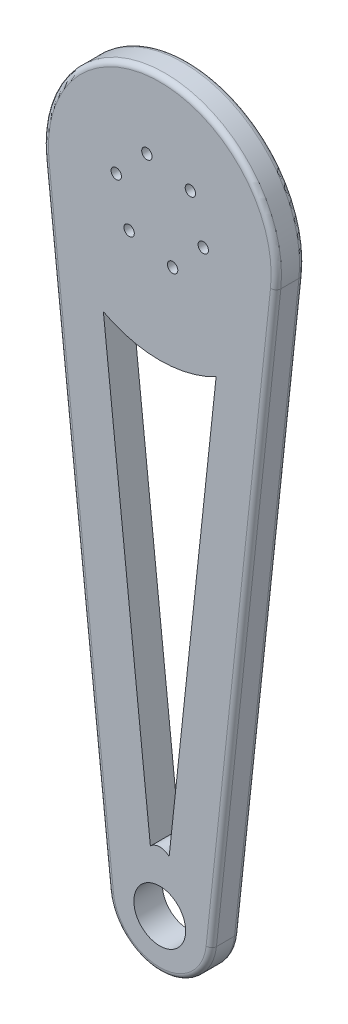
ISO-10303-21;
HEADER;
FILE_DESCRIPTION(('STEP AP214'),'2;1');
FILE_NAME('part.step','',(''),(''),'','','');
FILE_SCHEMA(('AUTOMOTIVE_DESIGN { 1 0 10303 214 1 1 1 1 }'));
ENDSEC;
DATA;
#1=APPLICATION_CONTEXT('core data for automotive mechanical design processes');
#2=APPLICATION_PROTOCOL_DEFINITION('international standard','automotive_design',2000,#1);
#3=PRODUCT_CONTEXT('',#1,'mechanical');
#4=PRODUCT('Part','Part','',(#3));
#5=PRODUCT_RELATED_PRODUCT_CATEGORY('part','',(#4));
#6=PRODUCT_DEFINITION_FORMATION('','',#4);
#7=PRODUCT_DEFINITION_CONTEXT('part definition',#1,'design');
#8=PRODUCT_DEFINITION('design','',#6,#7);
#9=PRODUCT_DEFINITION_SHAPE('','',#8);
#10=(LENGTH_UNIT() NAMED_UNIT(*) SI_UNIT(.MILLI.,.METRE.));
#11=(NAMED_UNIT(*) PLANE_ANGLE_UNIT() SI_UNIT($,.RADIAN.));
#12=(NAMED_UNIT(*) SI_UNIT($,.STERADIAN.) SOLID_ANGLE_UNIT());
#13=UNCERTAINTY_MEASURE_WITH_UNIT(LENGTH_MEASURE(1.E-05),#10,'distance_accuracy_value','');
#14=(GEOMETRIC_REPRESENTATION_CONTEXT(3) GLOBAL_UNCERTAINTY_ASSIGNED_CONTEXT((#13)) GLOBAL_UNIT_ASSIGNED_CONTEXT((#10,
#11,#12)) REPRESENTATION_CONTEXT('',''));
#15=CARTESIAN_POINT('',(0.,0.,0.));
#16=DIRECTION('',(0.,0.,1.));
#17=DIRECTION('',(1.,0.,0.));
#18=AXIS2_PLACEMENT_3D('',#15,#16,#17);
#19=CARTESIAN_POINT('',(0.,0.,11.));
#20=DIRECTION('',(0.,0.,-1.));
#21=DIRECTION('',(-1.,0.,0.));
#22=AXIS2_PLACEMENT_3D('',#19,#20,#21);
#23=CYLINDRICAL_SURFACE('',#22,45.);
#24=DIRECTION('',(0.,0.,-1.));
#25=VECTOR('',#24,1.);
#26=CARTESIAN_POINT('',(-44.744635323375,-4.7872340425532,11.));
#27=LINE('',#26,#25);
#28=CARTESIAN_POINT('',(-44.744635323375,-4.7872340425532,9.));
#29=VERTEX_POINT('',#28);
#30=CARTESIAN_POINT('',(-44.744635323375,-4.7872340425532,2.));
#31=VERTEX_POINT('',#30);
#32=EDGE_CURVE('E186',#29,#31,#27,.T.);
#33=ORIENTED_EDGE('',*,*,#32,.F.);
#34=CARTESIAN_POINT('',(0.,0.,9.));
#35=DIRECTION('',(0.,0.,-1.));
#36=DIRECTION('',(-1.,0.,0.));
#37=AXIS2_PLACEMENT_3D('',#34,#35,#36);
#38=CIRCLE('',#37,45.);
#39=CARTESIAN_POINT('',(44.744635323375,-4.78723404255319,9.));
#40=VERTEX_POINT('',#39);
#41=EDGE_CURVE('E200',#29,#40,#38,.T.);
#42=ORIENTED_EDGE('',*,*,#41,.T.);
#43=DIRECTION('',(0.,0.,-1.));
#44=VECTOR('',#43,1.);
#45=CARTESIAN_POINT('',(44.744635323375,-4.78723404255319,11.));
#46=LINE('',#45,#44);
#47=CARTESIAN_POINT('',(44.744635323375,-4.78723404255319,2.));
#48=VERTEX_POINT('',#47);
#49=EDGE_CURVE('E173',#40,#48,#46,.T.);
#50=ORIENTED_EDGE('',*,*,#49,.T.);
#51=CARTESIAN_POINT('',(0.,0.,2.));
#52=DIRECTION('',(0.,0.,-1.));
#53=DIRECTION('',(-1.,0.,0.));
#54=AXIS2_PLACEMENT_3D('',#51,#52,#53);
#55=CIRCLE('',#54,45.);
#56=EDGE_CURVE('E198',#48,#31,#55,.F.);
#57=ORIENTED_EDGE('',*,*,#56,.T.);
#58=EDGE_LOOP('',(#33,#42,#50,#57));
#59=FACE_BOUND('',#58,.T.);
#60=ADVANCED_FACE('F41',(#59),#23,.T.);
#61=CARTESIAN_POINT('',(-44.744635323375,-4.7872340425532,11.));
#62=DIRECTION('',(0.994325229408334,0.106382978723404,0.));
#63=DIRECTION('',(-0.106382978723404,0.994325229408334,0.));
#64=AXIS2_PLACEMENT_3D('',#61,#62,#63);
#65=PLANE('',#64);
#66=DIRECTION('',(0.,0.,-1.));
#67=VECTOR('',#66,1.);
#68=CARTESIAN_POINT('',(-19.8865045881667,-237.127659574468,11.));
#69=LINE('',#68,#67);
#70=CARTESIAN_POINT('',(-19.8865045881667,-237.127659574468,9.));
#71=VERTEX_POINT('',#70);
#72=CARTESIAN_POINT('',(-19.8865045881667,-237.127659574468,2.));
#73=VERTEX_POINT('',#72);
#74=EDGE_CURVE('E183',#71,#73,#69,.T.);
#75=ORIENTED_EDGE('',*,*,#74,.F.);
#76=DIRECTION('',(0.106382978723404,-0.994325229408334,0.));
#77=VECTOR('',#76,1.);
#78=CARTESIAN_POINT('',(-44.744635323375,-4.7872340425532,9.));
#79=LINE('',#78,#77);
#80=EDGE_CURVE('E214',#71,#29,#79,.F.);
#81=ORIENTED_EDGE('',*,*,#80,.T.);
#82=ORIENTED_EDGE('',*,*,#32,.T.);
#83=DIRECTION('',(0.106382978723404,-0.994325229408334,0.));
#84=VECTOR('',#83,1.);
#85=CARTESIAN_POINT('',(-19.8865045881667,-237.127659574468,2.));
#86=LINE('',#85,#84);
#87=EDGE_CURVE('E212',#31,#73,#86,.T.);
#88=ORIENTED_EDGE('',*,*,#87,.T.);
#89=EDGE_LOOP('',(#75,#81,#82,#88));
#90=FACE_BOUND('',#89,.T.);
#91=ADVANCED_FACE('F316',(#90),#65,.F.);
#92=CARTESIAN_POINT('',(0.,-235.,11.));
#93=DIRECTION('',(0.,0.,-1.));
#94=DIRECTION('',(-1.,0.,0.));
#95=AXIS2_PLACEMENT_3D('',#92,#93,#94);
#96=CYLINDRICAL_SURFACE('',#95,20.);
#97=DIRECTION('',(0.,0.,-1.));
#98=VECTOR('',#97,1.);
#99=CARTESIAN_POINT('',(19.8865045881667,-237.127659574468,11.));
#100=LINE('',#99,#98);
#101=CARTESIAN_POINT('',(19.8865045881667,-237.127659574468,9.));
#102=VERTEX_POINT('',#101);
#103=CARTESIAN_POINT('',(19.8865045881667,-237.127659574468,2.));
#104=VERTEX_POINT('',#103);
#105=EDGE_CURVE('E180',#102,#104,#100,.T.);
#106=ORIENTED_EDGE('',*,*,#105,.F.);
#107=CARTESIAN_POINT('',(0.,-235.,9.));
#108=DIRECTION('',(0.,0.,-1.));
#109=DIRECTION('',(-1.,0.,0.));
#110=AXIS2_PLACEMENT_3D('',#107,#108,#109);
#111=CIRCLE('',#110,20.);
#112=EDGE_CURVE('E206',#102,#71,#111,.T.);
#113=ORIENTED_EDGE('',*,*,#112,.T.);
#114=ORIENTED_EDGE('',*,*,#74,.T.);
#115=CARTESIAN_POINT('',(0.,-235.,2.));
#116=DIRECTION('',(0.,0.,-1.));
#117=DIRECTION('',(-1.,0.,0.));
#118=AXIS2_PLACEMENT_3D('',#115,#116,#117);
#119=CIRCLE('',#118,20.);
#120=EDGE_CURVE('E203',#73,#104,#119,.F.);
#121=ORIENTED_EDGE('',*,*,#120,.T.);
#122=EDGE_LOOP('',(#106,#113,#114,#121));
#123=FACE_BOUND('',#122,.T.);
#124=ADVANCED_FACE('F322',(#123),#96,.T.);
#125=CARTESIAN_POINT('',(44.744635323375,-4.78723404255319,11.));
#126=DIRECTION('',(-0.994325229408334,0.106382978723404,0.));
#127=DIRECTION('',(-0.106382978723404,-0.994325229408334,0.));
#128=AXIS2_PLACEMENT_3D('',#125,#126,#127);
#129=PLANE('',#128);
#130=ORIENTED_EDGE('',*,*,#49,.F.);
#131=DIRECTION('',(0.106382978723404,0.994325229408334,0.));
#132=VECTOR('',#131,1.);
#133=CARTESIAN_POINT('',(44.744635323375,-4.78723404255319,9.));
#134=LINE('',#133,#132);
#135=EDGE_CURVE('E210',#40,#102,#134,.F.);
#136=ORIENTED_EDGE('',*,*,#135,.T.);
#137=ORIENTED_EDGE('',*,*,#105,.T.);
#138=DIRECTION('',(0.106382978723404,0.994325229408334,0.));
#139=VECTOR('',#138,1.);
#140=CARTESIAN_POINT('',(44.744635323375,-4.78723404255319,2.));
#141=LINE('',#140,#139);
#142=EDGE_CURVE('E208',#104,#48,#141,.T.);
#143=ORIENTED_EDGE('',*,*,#142,.T.);
#144=EDGE_LOOP('',(#130,#136,#137,#143));
#145=FACE_BOUND('',#144,.T.);
#146=ADVANCED_FACE('F282',(#145),#129,.F.);
#147=CARTESIAN_POINT('',(0.,0.,11.));
#148=DIRECTION('',(0.,0.,-1.));
#149=DIRECTION('',(-1.,0.,0.));
#150=AXIS2_PLACEMENT_3D('',#147,#148,#149);
#151=PLANE('',#150);
#152=CARTESIAN_POINT('',(-16.7892443822872,3.96027436825242,11.));
#153=DIRECTION('',(0.,0.,1.));
#154=DIRECTION('',(1.,0.,0.));
#155=AXIS2_PLACEMENT_3D('',#152,#153,#154);
#156=CIRCLE('',#155,2.);
#157=CARTESIAN_POINT('',(-14.7892443822872,3.96027436825242,11.));
#158=VERTEX_POINT('',#157);
#159=EDGE_CURVE('E243',#158,#158,#156,.T.);
#160=ORIENTED_EDGE('',*,*,#159,.F.);
#161=EDGE_LOOP('',(#160));
#162=FACE_BOUND('',#161,.T.);
#163=CARTESIAN_POINT('',(-4.96492398228065,16.5200493295321,11.));
#164=DIRECTION('',(0.,0.,1.));
#165=DIRECTION('',(1.,0.,0.));
#166=AXIS2_PLACEMENT_3D('',#163,#164,#165);
#167=CIRCLE('',#166,2.);
#168=CARTESIAN_POINT('',(-2.96492398228065,16.5200493295321,11.));
#169=VERTEX_POINT('',#168);
#170=EDGE_CURVE('E271',#169,#169,#167,.T.);
#171=ORIENTED_EDGE('',*,*,#170,.F.);
#172=EDGE_LOOP('',(#171));
#173=FACE_BOUND('',#172,.T.);
#174=CARTESIAN_POINT('',(11.8243204000066,12.5597749612797,11.));
#175=DIRECTION('',(0.,0.,1.));
#176=DIRECTION('',(1.,0.,0.));
#177=AXIS2_PLACEMENT_3D('',#174,#175,#176);
#178=CIRCLE('',#177,2.);
#179=CARTESIAN_POINT('',(13.8243204000066,12.5597749612797,11.));
#180=VERTEX_POINT('',#179);
#181=EDGE_CURVE('E268',#180,#180,#178,.T.);
#182=ORIENTED_EDGE('',*,*,#181,.F.);
#183=EDGE_LOOP('',(#182));
#184=FACE_BOUND('',#183,.T.);
#185=CARTESIAN_POINT('',(16.7892443822872,-3.96027436825241,11.));
#186=DIRECTION('',(0.,0.,1.));
#187=DIRECTION('',(1.,0.,0.));
#188=AXIS2_PLACEMENT_3D('',#185,#186,#187);
#189=CIRCLE('',#188,2.);
#190=CARTESIAN_POINT('',(18.7892443822872,-3.96027436825241,11.));
#191=VERTEX_POINT('',#190);
#192=EDGE_CURVE('E265',#191,#191,#189,.T.);
#193=ORIENTED_EDGE('',*,*,#192,.F.);
#194=EDGE_LOOP('',(#193));
#195=FACE_BOUND('',#194,.T.);
#196=CARTESIAN_POINT('',(4.96492398228066,-16.5200493295321,11.));
#197=DIRECTION('',(0.,0.,1.));
#198=DIRECTION('',(1.,0.,0.));
#199=AXIS2_PLACEMENT_3D('',#196,#197,#198);
#200=CIRCLE('',#199,2.);
#201=CARTESIAN_POINT('',(6.96492398228066,-16.5200493295321,11.));
#202=VERTEX_POINT('',#201);
#203=EDGE_CURVE('E262',#202,#202,#200,.T.);
#204=ORIENTED_EDGE('',*,*,#203,.F.);
#205=EDGE_LOOP('',(#204));
#206=FACE_BOUND('',#205,.T.);
#207=CARTESIAN_POINT('',(-11.8243204000066,-12.5597749612797,11.));
#208=DIRECTION('',(0.,0.,1.));
#209=DIRECTION('',(1.,0.,0.));
#210=AXIS2_PLACEMENT_3D('',#207,#208,#209);
#211=CIRCLE('',#210,2.);
#212=CARTESIAN_POINT('',(-9.82432040000657,-12.5597749612797,11.));
#213=VERTEX_POINT('',#212);
#214=EDGE_CURVE('E259',#213,#213,#211,.T.);
#215=ORIENTED_EDGE('',*,*,#214,.F.);
#216=EDGE_LOOP('',(#215));
#217=FACE_BOUND('',#216,.T.);
#218=DIRECTION('',(-0.106382978723404,0.994325229408334,0.));
#219=VECTOR('',#218,1.);
#220=CARTESIAN_POINT('',(-26.2400238080358,-2.80742337809627,11.));
#221=LINE('',#220,#219);
#222=CARTESIAN_POINT('',(-3.61533826232206,-214.272602446108,11.));
#223=VERTEX_POINT('',#222);
#224=CARTESIAN_POINT('',(-21.7598242236514,-44.6823128857545,11.));
#225=VERTEX_POINT('',#224);
#226=EDGE_CURVE('E163',#223,#225,#221,.T.);
#227=ORIENTED_EDGE('',*,*,#226,.T.);
#228=CARTESIAN_POINT('',(0.,-3.35092271043229,11.));
#229=DIRECTION('',(0.,0.,-1.));
#230=DIRECTION('',(-1.,0.,0.));
#231=AXIS2_PLACEMENT_3D('',#228,#229,#230);
#232=CIRCLE('',#231,46.7094611836717);
#233=CARTESIAN_POINT('',(21.7598242236514,-44.6823128857545,11.));
#234=VERTEX_POINT('',#233);
#235=EDGE_CURVE('E166',#225,#234,#232,.F.);
#236=ORIENTED_EDGE('',*,*,#235,.T.);
#237=DIRECTION('',(-0.106382978723404,-0.994325229408334,0.));
#238=VECTOR('',#237,1.);
#239=CARTESIAN_POINT('',(26.2400238080358,-2.80742337809627,11.));
#240=LINE('',#239,#238);
#241=CARTESIAN_POINT('',(3.6259912783284,-214.173032357815,11.));
#242=VERTEX_POINT('',#241);
#243=EDGE_CURVE('E158',#234,#242,#240,.T.);
#244=ORIENTED_EDGE('',*,*,#243,.T.);
#245=CARTESIAN_POINT('',(0.0551115521497599,-217.843482172287,11.));
#246=DIRECTION('',(0.,0.,-1.));
#247=DIRECTION('',(-1.,0.,0.));
#248=AXIS2_PLACEMENT_3D('',#245,#246,#247);
#249=CIRCLE('',#248,5.12087725486467);
#250=EDGE_CURVE('E138',#242,#223,#249,.F.);
#251=ORIENTED_EDGE('',*,*,#250,.T.);
#252=EDGE_LOOP('',(#227,#236,#244,#251));
#253=FACE_BOUND('',#252,.T.);
#254=CARTESIAN_POINT('',(0.,-235.,11.));
#255=DIRECTION('',(0.,0.,-1.));
#256=DIRECTION('',(-1.,0.,0.));
#257=AXIS2_PLACEMENT_3D('',#254,#255,#256);
#258=CIRCLE('',#257,18.);
#259=CARTESIAN_POINT('',(-17.89785412935,-236.914893617021,11.));
#260=VERTEX_POINT('',#259);
#261=CARTESIAN_POINT('',(17.89785412935,-236.914893617021,11.));
#262=VERTEX_POINT('',#261);
#263=EDGE_CURVE('E191',#260,#262,#258,.F.);
#264=ORIENTED_EDGE('',*,*,#263,.T.);
#265=DIRECTION('',(0.106382978723404,0.994325229408334,0.));
#266=VECTOR('',#265,1.);
#267=CARTESIAN_POINT('',(42.7559848645584,-4.57446808510638,11.));
#268=LINE('',#267,#266);
#269=CARTESIAN_POINT('',(42.7559848645584,-4.57446808510638,11.));
#270=VERTEX_POINT('',#269);
#271=EDGE_CURVE('E196',#262,#270,#268,.T.);
#272=ORIENTED_EDGE('',*,*,#271,.T.);
#273=CARTESIAN_POINT('',(0.,0.,11.));
#274=DIRECTION('',(0.,0.,-1.));
#275=DIRECTION('',(-1.,0.,0.));
#276=AXIS2_PLACEMENT_3D('',#273,#274,#275);
#277=CIRCLE('',#276,43.);
#278=CARTESIAN_POINT('',(-42.7559848645584,-4.57446808510639,11.));
#279=VERTEX_POINT('',#278);
#280=EDGE_CURVE('E193',#270,#279,#277,.F.);
#281=ORIENTED_EDGE('',*,*,#280,.T.);
#282=DIRECTION('',(0.106382978723404,-0.994325229408334,0.));
#283=VECTOR('',#282,1.);
#284=CARTESIAN_POINT('',(-42.7559848645584,-4.57446808510639,11.));
#285=LINE('',#284,#283);
#286=EDGE_CURVE('E189',#279,#260,#285,.T.);
#287=ORIENTED_EDGE('',*,*,#286,.T.);
#288=EDGE_LOOP('',(#264,#272,#281,#287));
#289=FACE_BOUND('',#288,.T.);
#290=CARTESIAN_POINT('',(0.,-235.836034694728,11.));
#291=DIRECTION('',(0.,0.,-1.));
#292=DIRECTION('',(-1.,0.,0.));
#293=AXIS2_PLACEMENT_3D('',#290,#291,#292);
#294=CIRCLE('',#293,10.);
#295=CARTESIAN_POINT('',(-10.,-235.836034694728,11.));
#296=VERTEX_POINT('',#295);
#297=EDGE_CURVE('E170',#296,#296,#294,.T.);
#298=ORIENTED_EDGE('',*,*,#297,.T.);
#299=EDGE_LOOP('',(#298));
#300=FACE_BOUND('',#299,.T.);
#301=ADVANCED_FACE('F279',(#162,#173,#184,#195,#206,#217,#253,#289,#300),#151,.F.);
#302=CARTESIAN_POINT('',(0.,0.,0.));
#303=DIRECTION('',(0.,0.,-1.));
#304=DIRECTION('',(-1.,0.,0.));
#305=AXIS2_PLACEMENT_3D('',#302,#303,#304);
#306=PLANE('',#305);
#307=CARTESIAN_POINT('',(-16.7892443822872,3.96027436825242,0.));
#308=DIRECTION('',(0.,0.,-1.));
#309=DIRECTION('',(-1.,0.,0.));
#310=AXIS2_PLACEMENT_3D('',#307,#308,#309);
#311=CIRCLE('',#310,2.);
#312=CARTESIAN_POINT('',(-18.7892443822872,3.96027436825242,0.));
#313=VERTEX_POINT('',#312);
#314=EDGE_CURVE('E45',#313,#313,#311,.T.);
#315=ORIENTED_EDGE('',*,*,#314,.F.);
#316=EDGE_LOOP('',(#315));
#317=FACE_BOUND('',#316,.T.);
#318=CARTESIAN_POINT('',(-4.96492398228065,16.5200493295321,0.));
#319=DIRECTION('',(0.,0.,-1.));
#320=DIRECTION('',(-1.,0.,0.));
#321=AXIS2_PLACEMENT_3D('',#318,#319,#320);
#322=CIRCLE('',#321,2.);
#323=CARTESIAN_POINT('',(-6.96492398228065,16.5200493295321,0.));
#324=VERTEX_POINT('',#323);
#325=EDGE_CURVE('E251',#324,#324,#322,.T.);
#326=ORIENTED_EDGE('',*,*,#325,.F.);
#327=EDGE_LOOP('',(#326));
#328=FACE_BOUND('',#327,.T.);
#329=CARTESIAN_POINT('',(11.8243204000066,12.5597749612797,0.));
#330=DIRECTION('',(0.,0.,-1.));
#331=DIRECTION('',(-1.,0.,0.));
#332=AXIS2_PLACEMENT_3D('',#329,#330,#331);
#333=CIRCLE('',#332,2.);
#334=CARTESIAN_POINT('',(9.82432040000657,12.5597749612797,0.));
#335=VERTEX_POINT('',#334);
#336=EDGE_CURVE('E249',#335,#335,#333,.T.);
#337=ORIENTED_EDGE('',*,*,#336,.F.);
#338=EDGE_LOOP('',(#337));
#339=FACE_BOUND('',#338,.T.);
#340=CARTESIAN_POINT('',(16.7892443822872,-3.96027436825241,0.));
#341=DIRECTION('',(0.,0.,-1.));
#342=DIRECTION('',(-1.,0.,0.));
#343=AXIS2_PLACEMENT_3D('',#340,#341,#342);
#344=CIRCLE('',#343,2.);
#345=CARTESIAN_POINT('',(14.7892443822872,-3.96027436825241,0.));
#346=VERTEX_POINT('',#345);
#347=EDGE_CURVE('E246',#346,#346,#344,.T.);
#348=ORIENTED_EDGE('',*,*,#347,.F.);
#349=EDGE_LOOP('',(#348));
#350=FACE_BOUND('',#349,.T.);
#351=CARTESIAN_POINT('',(4.96492398228066,-16.5200493295321,0.));
#352=DIRECTION('',(0.,0.,-1.));
#353=DIRECTION('',(-1.,0.,0.));
#354=AXIS2_PLACEMENT_3D('',#351,#352,#353);
#355=CIRCLE('',#354,2.);
#356=CARTESIAN_POINT('',(2.96492398228065,-16.5200493295321,0.));
#357=VERTEX_POINT('',#356);
#358=EDGE_CURVE('E242',#357,#357,#355,.T.);
#359=ORIENTED_EDGE('',*,*,#358,.F.);
#360=EDGE_LOOP('',(#359));
#361=FACE_BOUND('',#360,.T.);
#362=CARTESIAN_POINT('',(-11.8243204000066,-12.5597749612797,0.));
#363=DIRECTION('',(0.,0.,-1.));
#364=DIRECTION('',(-1.,0.,0.));
#365=AXIS2_PLACEMENT_3D('',#362,#363,#364);
#366=CIRCLE('',#365,2.);
#367=CARTESIAN_POINT('',(-13.8243204000066,-12.5597749612797,0.));
#368=VERTEX_POINT('',#367);
#369=EDGE_CURVE('E239',#368,#368,#366,.T.);
#370=ORIENTED_EDGE('',*,*,#369,.F.);
#371=EDGE_LOOP('',(#370));
#372=FACE_BOUND('',#371,.T.);
#373=CARTESIAN_POINT('',(0.,-3.35092271043229,0.));
#374=DIRECTION('',(0.,0.,1.));
#375=DIRECTION('',(1.,0.,0.));
#376=AXIS2_PLACEMENT_3D('',#373,#374,#375);
#377=CIRCLE('',#376,46.7094611836717);
#378=CARTESIAN_POINT('',(-21.7598242236514,-44.6823128857545,0.));
#379=VERTEX_POINT('',#378);
#380=CARTESIAN_POINT('',(21.7598242236514,-44.6823128857545,0.));
#381=VERTEX_POINT('',#380);
#382=EDGE_CURVE('E66',#379,#381,#377,.T.);
#383=ORIENTED_EDGE('',*,*,#382,.F.);
#384=DIRECTION('',(-0.106382978723404,0.994325229408334,0.));
#385=VECTOR('',#384,1.);
#386=CARTESIAN_POINT('',(-21.7598242236514,-44.6823128857545,0.));
#387=LINE('',#386,#385);
#388=CARTESIAN_POINT('',(-3.61533826232206,-214.272602446108,0.));
#389=VERTEX_POINT('',#388);
#390=EDGE_CURVE('E151',#389,#379,#387,.T.);
#391=ORIENTED_EDGE('',*,*,#390,.F.);
#392=CARTESIAN_POINT('',(0.0551115521497599,-217.843482172287,0.));
#393=DIRECTION('',(0.,0.,1.));
#394=DIRECTION('',(1.,0.,0.));
#395=AXIS2_PLACEMENT_3D('',#392,#393,#394);
#396=CIRCLE('',#395,5.12087725486467);
#397=CARTESIAN_POINT('',(3.6259912783284,-214.173032357815,0.));
#398=VERTEX_POINT('',#397);
#399=EDGE_CURVE('E135',#398,#389,#396,.T.);
#400=ORIENTED_EDGE('',*,*,#399,.F.);
#401=DIRECTION('',(-0.106382978723404,-0.994325229408334,0.));
#402=VECTOR('',#401,1.);
#403=CARTESIAN_POINT('',(21.7598242236514,-44.6823128857545,0.));
#404=LINE('',#403,#402);
#405=EDGE_CURVE('E144',#381,#398,#404,.T.);
#406=ORIENTED_EDGE('',*,*,#405,.F.);
#407=EDGE_LOOP('',(#383,#391,#400,#406));
#408=FACE_BOUND('',#407,.T.);
#409=DIRECTION('',(0.106382978723404,0.994325229408334,0.));
#410=VECTOR('',#409,1.);
#411=CARTESIAN_POINT('',(17.89785412935,-236.914893617021,0.));
#412=LINE('',#411,#410);
#413=CARTESIAN_POINT('',(42.7559848645584,-4.57446808510638,0.));
#414=VERTEX_POINT('',#413);
#415=CARTESIAN_POINT('',(17.89785412935,-236.914893617021,0.));
#416=VERTEX_POINT('',#415);
#417=EDGE_CURVE('E216',#414,#416,#412,.F.);
#418=ORIENTED_EDGE('',*,*,#417,.T.);
#419=CARTESIAN_POINT('',(0.,-235.,0.));
#420=DIRECTION('',(0.,0.,-1.));
#421=DIRECTION('',(-1.,0.,0.));
#422=AXIS2_PLACEMENT_3D('',#419,#420,#421);
#423=CIRCLE('',#422,18.);
#424=CARTESIAN_POINT('',(-17.89785412935,-236.914893617021,0.));
#425=VERTEX_POINT('',#424);
#426=EDGE_CURVE('E11',#416,#425,#423,.T.);
#427=ORIENTED_EDGE('',*,*,#426,.T.);
#428=DIRECTION('',(0.106382978723404,-0.994325229408334,0.));
#429=VECTOR('',#428,1.);
#430=CARTESIAN_POINT('',(-42.7559848645584,-4.57446808510639,0.));
#431=LINE('',#430,#429);
#432=CARTESIAN_POINT('',(-42.7559848645584,-4.57446808510639,0.));
#433=VERTEX_POINT('',#432);
#434=EDGE_CURVE('E50',#425,#433,#431,.F.);
#435=ORIENTED_EDGE('',*,*,#434,.T.);
#436=CARTESIAN_POINT('',(0.,0.,0.));
#437=DIRECTION('',(0.,0.,-1.));
#438=DIRECTION('',(-1.,0.,0.));
#439=AXIS2_PLACEMENT_3D('',#436,#437,#438);
#440=CIRCLE('',#439,43.);
#441=EDGE_CURVE('E218',#433,#414,#440,.T.);
#442=ORIENTED_EDGE('',*,*,#441,.T.);
#443=EDGE_LOOP('',(#418,#427,#435,#442));
#444=FACE_BOUND('',#443,.T.);
#445=CARTESIAN_POINT('',(0.,-235.836034694728,0.));
#446=DIRECTION('',(0.,0.,-1.));
#447=DIRECTION('',(-1.,0.,0.));
#448=AXIS2_PLACEMENT_3D('',#445,#446,#447);
#449=CIRCLE('',#448,10.);
#450=CARTESIAN_POINT('',(-10.,-235.836034694728,0.));
#451=VERTEX_POINT('',#450);
#452=EDGE_CURVE('E174',#451,#451,#449,.T.);
#453=ORIENTED_EDGE('',*,*,#452,.F.);
#454=EDGE_LOOP('',(#453));
#455=FACE_BOUND('',#454,.T.);
#456=ADVANCED_FACE('F148',(#317,#328,#339,#350,#361,#372,#408,#444,#455),#306,.T.);
#457=CARTESIAN_POINT('',(0.,-235.836034694728,11.));
#458=DIRECTION('',(0.,0.,-1.));
#459=DIRECTION('',(-1.,0.,0.));
#460=AXIS2_PLACEMENT_3D('',#457,#458,#459);
#461=CYLINDRICAL_SURFACE('',#460,10.);
#462=ORIENTED_EDGE('',*,*,#297,.F.);
#463=EDGE_LOOP('',(#462));
#464=FACE_BOUND('',#463,.T.);
#465=ORIENTED_EDGE('',*,*,#452,.T.);
#466=EDGE_LOOP('',(#465));
#467=FACE_BOUND('',#466,.T.);
#468=ADVANCED_FACE('F300',(#464,#467),#461,.F.);
#469=CARTESIAN_POINT('',(0.,-235.,9.));
#470=DIRECTION('',(0.,0.,-1.));
#471=DIRECTION('',(-1.,0.,0.));
#472=AXIS2_PLACEMENT_3D('',#469,#470,#471);
#473=TOROIDAL_SURFACE('',#472,18.,2.);
#474=CARTESIAN_POINT('',(-17.89785412935,-236.914893617021,9.));
#475=DIRECTION('',(-0.10638297872341,0.994325229408333,0.));
#476=DIRECTION('',(-0.994325229408333,-0.10638297872341,0.));
#477=AXIS2_PLACEMENT_3D('',#474,#475,#476);
#478=CIRCLE('',#477,2.);
#479=EDGE_CURVE('E226',#71,#260,#478,.T.);
#480=ORIENTED_EDGE('',*,*,#479,.F.);
#481=ORIENTED_EDGE('',*,*,#112,.F.);
#482=CARTESIAN_POINT('',(17.89785412935,-236.914893617021,9.));
#483=DIRECTION('',(0.10638297872341,0.994325229408333,0.));
#484=DIRECTION('',(-0.994325229408333,0.10638297872341,0.));
#485=AXIS2_PLACEMENT_3D('',#482,#483,#484);
#486=CIRCLE('',#485,2.);
#487=EDGE_CURVE('E177',#262,#102,#486,.T.);
#488=ORIENTED_EDGE('',*,*,#487,.F.);
#489=ORIENTED_EDGE('',*,*,#263,.F.);
#490=EDGE_LOOP('',(#480,#481,#488,#489));
#491=FACE_BOUND('',#490,.T.);
#492=ADVANCED_FACE('F303',(#491),#473,.T.);
#493=CARTESIAN_POINT('',(42.7559848645584,-4.57446808510638,9.));
#494=DIRECTION('',(0.106382978723404,0.994325229408334,0.));
#495=DIRECTION('',(-0.994325229408334,0.106382978723404,0.));
#496=AXIS2_PLACEMENT_3D('',#493,#494,#495);
#497=CYLINDRICAL_SURFACE('',#496,2.);
#498=ORIENTED_EDGE('',*,*,#487,.T.);
#499=ORIENTED_EDGE('',*,*,#135,.F.);
#500=CARTESIAN_POINT('',(42.7559848645584,-4.57446808510638,9.));
#501=DIRECTION('',(0.106382978723404,0.994325229408334,0.));
#502=DIRECTION('',(-0.994325229408334,0.106382978723404,0.));
#503=AXIS2_PLACEMENT_3D('',#500,#501,#502);
#504=CIRCLE('',#503,2.);
#505=EDGE_CURVE('E223',#270,#40,#504,.T.);
#506=ORIENTED_EDGE('',*,*,#505,.F.);
#507=ORIENTED_EDGE('',*,*,#271,.F.);
#508=EDGE_LOOP('',(#498,#499,#506,#507));
#509=FACE_BOUND('',#508,.T.);
#510=ADVANCED_FACE('F335',(#509),#497,.T.);
#511=CARTESIAN_POINT('',(-42.7559848645584,-4.57446808510639,9.));
#512=DIRECTION('',(0.106382978723404,-0.994325229408334,0.));
#513=DIRECTION('',(0.994325229408334,0.106382978723404,0.));
#514=AXIS2_PLACEMENT_3D('',#511,#512,#513);
#515=CYLINDRICAL_SURFACE('',#514,2.);
#516=ORIENTED_EDGE('',*,*,#479,.T.);
#517=ORIENTED_EDGE('',*,*,#286,.F.);
#518=CARTESIAN_POINT('',(-42.7559848645584,-4.57446808510639,9.));
#519=DIRECTION('',(-0.106382978723404,0.994325229408334,0.));
#520=DIRECTION('',(-0.994325229408334,-0.106382978723404,0.));
#521=AXIS2_PLACEMENT_3D('',#518,#519,#520);
#522=CIRCLE('',#521,2.);
#523=EDGE_CURVE('E221',#29,#279,#522,.T.);
#524=ORIENTED_EDGE('',*,*,#523,.F.);
#525=ORIENTED_EDGE('',*,*,#80,.F.);
#526=EDGE_LOOP('',(#516,#517,#524,#525));
#527=FACE_BOUND('',#526,.T.);
#528=ADVANCED_FACE('F331',(#527),#515,.T.);
#529=CARTESIAN_POINT('',(0.,0.,9.));
#530=DIRECTION('',(0.,0.,-1.));
#531=DIRECTION('',(-1.,0.,0.));
#532=AXIS2_PLACEMENT_3D('',#529,#530,#531);
#533=TOROIDAL_SURFACE('',#532,43.,2.);
#534=ORIENTED_EDGE('',*,*,#505,.T.);
#535=ORIENTED_EDGE('',*,*,#41,.F.);
#536=ORIENTED_EDGE('',*,*,#523,.T.);
#537=ORIENTED_EDGE('',*,*,#280,.F.);
#538=EDGE_LOOP('',(#534,#535,#536,#537));
#539=FACE_BOUND('',#538,.T.);
#540=ADVANCED_FACE('F328',(#539),#533,.T.);
#541=CARTESIAN_POINT('',(0.,0.,2.));
#542=DIRECTION('',(0.,0.,-1.));
#543=DIRECTION('',(-1.,0.,0.));
#544=AXIS2_PLACEMENT_3D('',#541,#542,#543);
#545=TOROIDAL_SURFACE('',#544,43.,2.);
#546=CARTESIAN_POINT('',(42.7559848645584,-4.57446808510638,2.));
#547=DIRECTION('',(-0.106382978723404,-0.994325229408334,0.));
#548=DIRECTION('',(0.994325229408334,-0.106382978723404,0.));
#549=AXIS2_PLACEMENT_3D('',#546,#547,#548);
#550=CIRCLE('',#549,2.);
#551=EDGE_CURVE('E234',#414,#48,#550,.T.);
#552=ORIENTED_EDGE('',*,*,#551,.F.);
#553=ORIENTED_EDGE('',*,*,#441,.F.);
#554=CARTESIAN_POINT('',(-42.7559848645584,-4.57446808510639,2.));
#555=DIRECTION('',(0.106382978723404,-0.994325229408334,0.));
#556=DIRECTION('',(0.994325229408334,0.106382978723404,0.));
#557=AXIS2_PLACEMENT_3D('',#554,#555,#556);
#558=CIRCLE('',#557,2.);
#559=EDGE_CURVE('E224',#31,#433,#558,.T.);
#560=ORIENTED_EDGE('',*,*,#559,.F.);
#561=ORIENTED_EDGE('',*,*,#56,.F.);
#562=EDGE_LOOP('',(#552,#553,#560,#561));
#563=FACE_BOUND('',#562,.T.);
#564=ADVANCED_FACE('F43',(#563),#545,.T.);
#565=CARTESIAN_POINT('',(-42.7559848645584,-4.57446808510639,2.));
#566=DIRECTION('',(-0.106382978723404,0.994325229408334,0.));
#567=DIRECTION('',(-0.994325229408334,-0.106382978723404,0.));
#568=AXIS2_PLACEMENT_3D('',#565,#566,#567);
#569=CYLINDRICAL_SURFACE('',#568,2.);
#570=ORIENTED_EDGE('',*,*,#559,.T.);
#571=ORIENTED_EDGE('',*,*,#434,.F.);
#572=CARTESIAN_POINT('',(-17.89785412935,-236.914893617021,2.));
#573=DIRECTION('',(0.10638297872341,-0.994325229408333,0.));
#574=DIRECTION('',(0.994325229408333,0.10638297872341,0.));
#575=AXIS2_PLACEMENT_3D('',#572,#573,#574);
#576=CIRCLE('',#575,2.);
#577=EDGE_CURVE('E232',#73,#425,#576,.T.);
#578=ORIENTED_EDGE('',*,*,#577,.F.);
#579=ORIENTED_EDGE('',*,*,#87,.F.);
#580=EDGE_LOOP('',(#570,#571,#578,#579));
#581=FACE_BOUND('',#580,.T.);
#582=ADVANCED_FACE('F350',(#581),#569,.T.);
#583=CARTESIAN_POINT('',(42.7559848645584,-4.57446808510638,2.));
#584=DIRECTION('',(-0.106382978723404,-0.994325229408334,0.));
#585=DIRECTION('',(0.994325229408334,-0.106382978723404,0.));
#586=AXIS2_PLACEMENT_3D('',#583,#584,#585);
#587=CYLINDRICAL_SURFACE('',#586,2.);
#588=ORIENTED_EDGE('',*,*,#551,.T.);
#589=ORIENTED_EDGE('',*,*,#142,.F.);
#590=CARTESIAN_POINT('',(17.89785412935,-236.914893617021,2.));
#591=DIRECTION('',(-0.10638297872341,-0.994325229408333,0.));
#592=DIRECTION('',(0.994325229408333,-0.10638297872341,0.));
#593=AXIS2_PLACEMENT_3D('',#590,#591,#592);
#594=CIRCLE('',#593,2.);
#595=EDGE_CURVE('E169',#416,#104,#594,.T.);
#596=ORIENTED_EDGE('',*,*,#595,.F.);
#597=ORIENTED_EDGE('',*,*,#417,.F.);
#598=EDGE_LOOP('',(#588,#589,#596,#597));
#599=FACE_BOUND('',#598,.T.);
#600=ADVANCED_FACE('F347',(#599),#587,.T.);
#601=CARTESIAN_POINT('',(0.,-235.,2.));
#602=DIRECTION('',(0.,0.,-1.));
#603=DIRECTION('',(-1.,0.,0.));
#604=AXIS2_PLACEMENT_3D('',#601,#602,#603);
#605=TOROIDAL_SURFACE('',#604,18.,2.);
#606=ORIENTED_EDGE('',*,*,#577,.T.);
#607=ORIENTED_EDGE('',*,*,#426,.F.);
#608=ORIENTED_EDGE('',*,*,#595,.T.);
#609=ORIENTED_EDGE('',*,*,#120,.F.);
#610=EDGE_LOOP('',(#606,#607,#608,#609));
#611=FACE_BOUND('',#610,.T.);
#612=ADVANCED_FACE('F343',(#611),#605,.T.);
#613=CARTESIAN_POINT('',(0.,-3.35092271043229,20.));
#614=DIRECTION('',(0.,0.,-1.));
#615=DIRECTION('',(-1.,0.,0.));
#616=AXIS2_PLACEMENT_3D('',#613,#614,#615);
#617=CYLINDRICAL_SURFACE('',#616,46.7094611836717);
#618=DIRECTION('',(0.,0.,-1.));
#619=VECTOR('',#618,1.);
#620=CARTESIAN_POINT('',(-21.7598242236514,-44.6823128857545,20.));
#621=LINE('',#620,#619);
#622=EDGE_CURVE('E156',#225,#379,#621,.T.);
#623=ORIENTED_EDGE('',*,*,#622,.T.);
#624=ORIENTED_EDGE('',*,*,#382,.T.);
#625=DIRECTION('',(0.,0.,-1.));
#626=VECTOR('',#625,1.);
#627=CARTESIAN_POINT('',(21.7598242236514,-44.6823128857545,20.));
#628=LINE('',#627,#626);
#629=EDGE_CURVE('E141',#234,#381,#628,.T.);
#630=ORIENTED_EDGE('',*,*,#629,.F.);
#631=ORIENTED_EDGE('',*,*,#235,.F.);
#632=EDGE_LOOP('',(#623,#624,#630,#631));
#633=FACE_BOUND('',#632,.T.);
#634=ADVANCED_FACE('F346',(#633),#617,.T.);
#635=CARTESIAN_POINT('',(-21.7598242236514,-44.6823128857545,20.));
#636=DIRECTION('',(-0.994325229408334,-0.106382978723404,0.));
#637=DIRECTION('',(0.106382978723404,-0.994325229408334,0.));
#638=AXIS2_PLACEMENT_3D('',#635,#636,#637);
#639=PLANE('',#638);
#640=DIRECTION('',(0.,0.,-1.));
#641=VECTOR('',#640,1.);
#642=CARTESIAN_POINT('',(-3.61533826232206,-214.272602446108,20.));
#643=LINE('',#642,#641);
#644=EDGE_CURVE('E140',#223,#389,#643,.T.);
#645=ORIENTED_EDGE('',*,*,#644,.T.);
#646=ORIENTED_EDGE('',*,*,#390,.T.);
#647=ORIENTED_EDGE('',*,*,#622,.F.);
#648=ORIENTED_EDGE('',*,*,#226,.F.);
#649=EDGE_LOOP('',(#645,#646,#647,#648));
#650=FACE_BOUND('',#649,.T.);
#651=ADVANCED_FACE('F467',(#650),#639,.F.);
#652=CARTESIAN_POINT('',(0.0551115521497599,-217.843482172287,20.));
#653=DIRECTION('',(0.,0.,-1.));
#654=DIRECTION('',(-1.,0.,0.));
#655=AXIS2_PLACEMENT_3D('',#652,#653,#654);
#656=CYLINDRICAL_SURFACE('',#655,5.12087725486467);
#657=DIRECTION('',(0.,0.,-1.));
#658=VECTOR('',#657,1.);
#659=CARTESIAN_POINT('',(3.6259912783284,-214.173032357815,20.));
#660=LINE('',#659,#658);
#661=EDGE_CURVE('E58',#242,#398,#660,.T.);
#662=ORIENTED_EDGE('',*,*,#661,.T.);
#663=ORIENTED_EDGE('',*,*,#399,.T.);
#664=ORIENTED_EDGE('',*,*,#644,.F.);
#665=ORIENTED_EDGE('',*,*,#250,.F.);
#666=EDGE_LOOP('',(#662,#663,#664,#665));
#667=FACE_BOUND('',#666,.T.);
#668=ADVANCED_FACE('F132',(#667),#656,.T.);
#669=CARTESIAN_POINT('',(21.7598242236514,-44.6823128857545,20.));
#670=DIRECTION('',(0.994325229408334,-0.106382978723404,0.));
#671=DIRECTION('',(0.106382978723404,0.994325229408334,0.));
#672=AXIS2_PLACEMENT_3D('',#669,#670,#671);
#673=PLANE('',#672);
#674=ORIENTED_EDGE('',*,*,#629,.T.);
#675=ORIENTED_EDGE('',*,*,#405,.T.);
#676=ORIENTED_EDGE('',*,*,#661,.F.);
#677=ORIENTED_EDGE('',*,*,#243,.F.);
#678=EDGE_LOOP('',(#674,#675,#676,#677));
#679=FACE_BOUND('',#678,.T.);
#680=ADVANCED_FACE('F145',(#679),#673,.F.);
#681=CARTESIAN_POINT('',(-11.8243204000066,-12.5597749612797,-22.));
#682=DIRECTION('',(0.,0.,1.));
#683=DIRECTION('',(1.,0.,0.));
#684=AXIS2_PLACEMENT_3D('',#681,#682,#683);
#685=CYLINDRICAL_SURFACE('',#684,2.);
#686=ORIENTED_EDGE('',*,*,#369,.T.);
#687=EDGE_LOOP('',(#686));
#688=FACE_BOUND('',#687,.T.);
#689=ORIENTED_EDGE('',*,*,#214,.T.);
#690=EDGE_LOOP('',(#689));
#691=FACE_BOUND('',#690,.T.);
#692=ADVANCED_FACE('F490',(#688,#691),#685,.F.);
#693=CARTESIAN_POINT('',(4.96492398228066,-16.5200493295321,-22.));
#694=DIRECTION('',(0.,0.,1.));
#695=DIRECTION('',(1.,0.,0.));
#696=AXIS2_PLACEMENT_3D('',#693,#694,#695);
#697=CYLINDRICAL_SURFACE('',#696,2.);
#698=ORIENTED_EDGE('',*,*,#358,.T.);
#699=EDGE_LOOP('',(#698));
#700=FACE_BOUND('',#699,.T.);
#701=ORIENTED_EDGE('',*,*,#203,.T.);
#702=EDGE_LOOP('',(#701));
#703=FACE_BOUND('',#702,.T.);
#704=ADVANCED_FACE('F497',(#700,#703),#697,.F.);
#705=CARTESIAN_POINT('',(16.7892443822872,-3.96027436825241,-22.));
#706=DIRECTION('',(0.,0.,1.));
#707=DIRECTION('',(1.,0.,0.));
#708=AXIS2_PLACEMENT_3D('',#705,#706,#707);
#709=CYLINDRICAL_SURFACE('',#708,2.);
#710=ORIENTED_EDGE('',*,*,#347,.T.);
#711=EDGE_LOOP('',(#710));
#712=FACE_BOUND('',#711,.T.);
#713=ORIENTED_EDGE('',*,*,#192,.T.);
#714=EDGE_LOOP('',(#713));
#715=FACE_BOUND('',#714,.T.);
#716=ADVANCED_FACE('F506',(#712,#715),#709,.F.);
#717=CARTESIAN_POINT('',(11.8243204000066,12.5597749612797,-22.));
#718=DIRECTION('',(0.,0.,1.));
#719=DIRECTION('',(1.,0.,0.));
#720=AXIS2_PLACEMENT_3D('',#717,#718,#719);
#721=CYLINDRICAL_SURFACE('',#720,2.);
#722=ORIENTED_EDGE('',*,*,#336,.T.);
#723=EDGE_LOOP('',(#722));
#724=FACE_BOUND('',#723,.T.);
#725=ORIENTED_EDGE('',*,*,#181,.T.);
#726=EDGE_LOOP('',(#725));
#727=FACE_BOUND('',#726,.T.);
#728=ADVANCED_FACE('F515',(#724,#727),#721,.F.);
#729=CARTESIAN_POINT('',(-4.96492398228065,16.5200493295321,-22.));
#730=DIRECTION('',(0.,0.,1.));
#731=DIRECTION('',(1.,0.,0.));
#732=AXIS2_PLACEMENT_3D('',#729,#730,#731);
#733=CYLINDRICAL_SURFACE('',#732,2.);
#734=ORIENTED_EDGE('',*,*,#325,.T.);
#735=EDGE_LOOP('',(#734));
#736=FACE_BOUND('',#735,.T.);
#737=ORIENTED_EDGE('',*,*,#170,.T.);
#738=EDGE_LOOP('',(#737));
#739=FACE_BOUND('',#738,.T.);
#740=ADVANCED_FACE('F524',(#736,#739),#733,.F.);
#741=CARTESIAN_POINT('',(-16.7892443822872,3.96027436825242,-22.));
#742=DIRECTION('',(0.,0.,1.));
#743=DIRECTION('',(1.,0.,0.));
#744=AXIS2_PLACEMENT_3D('',#741,#742,#743);
#745=CYLINDRICAL_SURFACE('',#744,2.);
#746=ORIENTED_EDGE('',*,*,#314,.T.);
#747=EDGE_LOOP('',(#746));
#748=FACE_BOUND('',#747,.T.);
#749=ORIENTED_EDGE('',*,*,#159,.T.);
#750=EDGE_LOOP('',(#749));
#751=FACE_BOUND('',#750,.T.);
#752=ADVANCED_FACE('F277',(#748,#751),#745,.F.);
#753=CLOSED_SHELL('',(#60,#91,#124,#146,#301,#456,#468,#492,#510,#528,#540,#564,#582,#600,#612,
#634,#651,#668,#680,#692,#704,#716,#728,#740,#752));
#754=MANIFOLD_SOLID_BREP('B2',#753);
#755=ADVANCED_BREP_SHAPE_REPRESENTATION('',(#18,#754),#14);
#756=SHAPE_DEFINITION_REPRESENTATION(#9,#755);
ENDSEC;
END-ISO-10303-21;
